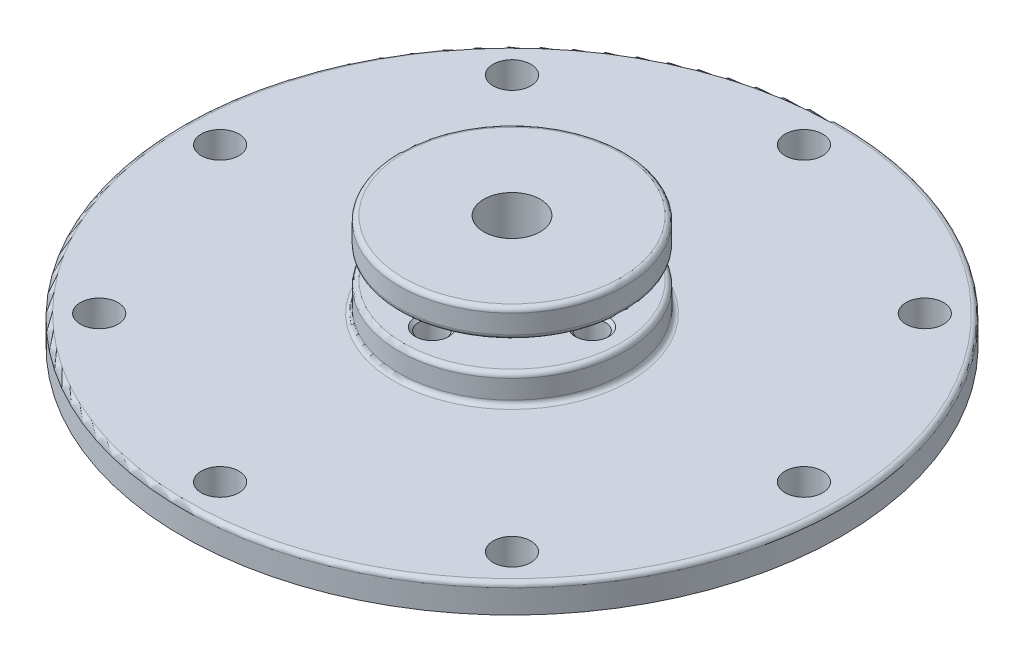
ISO-10303-21;
HEADER;
FILE_DESCRIPTION(('STEP AP214'),'2;1');
FILE_NAME('part.step','',(''),(''),'','','');
FILE_SCHEMA(('AUTOMOTIVE_DESIGN { 1 0 10303 214 1 1 1 1 }'));
ENDSEC;
DATA;
#1=APPLICATION_CONTEXT('core data for automotive mechanical design processes');
#2=APPLICATION_PROTOCOL_DEFINITION('international standard','automotive_design',2000,#1);
#3=PRODUCT_CONTEXT('',#1,'mechanical');
#4=PRODUCT('Part','Part','',(#3));
#5=PRODUCT_RELATED_PRODUCT_CATEGORY('part','',(#4));
#6=PRODUCT_DEFINITION_FORMATION('','',#4);
#7=PRODUCT_DEFINITION_CONTEXT('part definition',#1,'design');
#8=PRODUCT_DEFINITION('design','',#6,#7);
#9=PRODUCT_DEFINITION_SHAPE('','',#8);
#10=(LENGTH_UNIT() NAMED_UNIT(*) SI_UNIT(.MILLI.,.METRE.));
#11=(NAMED_UNIT(*) PLANE_ANGLE_UNIT() SI_UNIT($,.RADIAN.));
#12=(NAMED_UNIT(*) SI_UNIT($,.STERADIAN.) SOLID_ANGLE_UNIT());
#13=UNCERTAINTY_MEASURE_WITH_UNIT(LENGTH_MEASURE(1.E-05),#10,'distance_accuracy_value','');
#14=(GEOMETRIC_REPRESENTATION_CONTEXT(3) GLOBAL_UNCERTAINTY_ASSIGNED_CONTEXT((#13)) GLOBAL_UNIT_ASSIGNED_CONTEXT((#10,
#11,#12)) REPRESENTATION_CONTEXT('',''));
#15=CARTESIAN_POINT('',(0.,0.,0.));
#16=DIRECTION('',(0.,0.,1.));
#17=DIRECTION('',(1.,0.,0.));
#18=AXIS2_PLACEMENT_3D('',#15,#16,#17);
#19=CARTESIAN_POINT('',(0.,0.,0.));
#20=DIRECTION('',(0.,-1.,0.));
#21=DIRECTION('',(0.,0.,-1.));
#22=AXIS2_PLACEMENT_3D('',#19,#20,#21);
#23=CYLINDRICAL_SURFACE('',#22,3.);
#24=CARTESIAN_POINT('',(0.,16.,0.));
#25=DIRECTION('',(0.,-1.,0.));
#26=DIRECTION('',(0.,0.,-1.));
#27=AXIS2_PLACEMENT_3D('',#24,#25,#26);
#28=CIRCLE('',#27,3.);
#29=CARTESIAN_POINT('',(0.,16.,-3.));
#30=VERTEX_POINT('',#29);
#31=EDGE_CURVE('E88',#30,#30,#28,.T.);
#32=ORIENTED_EDGE('',*,*,#31,.F.);
#33=EDGE_LOOP('',(#32));
#34=FACE_BOUND('',#33,.T.);
#35=CARTESIAN_POINT('',(0.,9.,0.));
#36=DIRECTION('',(0.,-1.,0.));
#37=DIRECTION('',(0.,0.,-1.));
#38=AXIS2_PLACEMENT_3D('',#35,#36,#37);
#39=CIRCLE('',#38,3.);
#40=CARTESIAN_POINT('',(0.,9.,-3.));
#41=VERTEX_POINT('',#40);
#42=EDGE_CURVE('E12',#41,#41,#39,.T.);
#43=ORIENTED_EDGE('',*,*,#42,.T.);
#44=EDGE_LOOP('',(#43));
#45=FACE_BOUND('',#44,.T.);
#46=ADVANCED_FACE('F60',(#34,#45),#23,.F.);
#47=CARTESIAN_POINT('',(-3.,9.,0.));
#48=DIRECTION('',(0.,1.,0.));
#49=DIRECTION('',(0.,0.,1.));
#50=AXIS2_PLACEMENT_3D('',#47,#48,#49);
#51=PLANE('',#50);
#52=ORIENTED_EDGE('',*,*,#42,.F.);
#53=EDGE_LOOP('',(#52));
#54=FACE_BOUND('',#53,.T.);
#55=CARTESIAN_POINT('',(0.,9.,0.));
#56=DIRECTION('',(0.,-1.,0.));
#57=DIRECTION('',(0.,0.,-1.));
#58=AXIS2_PLACEMENT_3D('',#55,#56,#57);
#59=CIRCLE('',#58,6.);
#60=CARTESIAN_POINT('',(0.,9.,-6.));
#61=VERTEX_POINT('',#60);
#62=EDGE_CURVE('E66',#61,#61,#59,.T.);
#63=ORIENTED_EDGE('',*,*,#62,.T.);
#64=EDGE_LOOP('',(#63));
#65=FACE_BOUND('',#64,.T.);
#66=ADVANCED_FACE('F95',(#54,#65),#51,.F.);
#67=CARTESIAN_POINT('',(0.,0.,0.));
#68=DIRECTION('',(0.,-1.,0.));
#69=DIRECTION('',(0.,0.,-1.));
#70=AXIS2_PLACEMENT_3D('',#67,#68,#69);
#71=CYLINDRICAL_SURFACE('',#70,6.);
#72=ORIENTED_EDGE('',*,*,#62,.F.);
#73=EDGE_LOOP('',(#72));
#74=FACE_BOUND('',#73,.T.);
#75=CARTESIAN_POINT('',(0.,13.,0.));
#76=DIRECTION('',(0.,-1.,0.));
#77=DIRECTION('',(0.,0.,-1.));
#78=AXIS2_PLACEMENT_3D('',#75,#76,#77);
#79=CIRCLE('',#78,6.);
#80=CARTESIAN_POINT('',(0.,13.,-6.));
#81=VERTEX_POINT('',#80);
#82=EDGE_CURVE('E70',#81,#81,#79,.T.);
#83=ORIENTED_EDGE('',*,*,#82,.T.);
#84=EDGE_LOOP('',(#83));
#85=FACE_BOUND('',#84,.T.);
#86=ADVANCED_FACE('F99',(#74,#85),#71,.T.);
#87=CARTESIAN_POINT('',(-6.,13.,0.));
#88=DIRECTION('',(0.,1.,0.));
#89=DIRECTION('',(0.,0.,1.));
#90=AXIS2_PLACEMENT_3D('',#87,#88,#89);
#91=PLANE('',#90);
#92=ORIENTED_EDGE('',*,*,#82,.F.);
#93=EDGE_LOOP('',(#92));
#94=FACE_BOUND('',#93,.T.);
#95=CARTESIAN_POINT('',(0.,13.,0.));
#96=DIRECTION('',(0.,-1.,0.));
#97=DIRECTION('',(0.,0.,-1.));
#98=AXIS2_PLACEMENT_3D('',#95,#96,#97);
#99=CIRCLE('',#98,11.5);
#100=CARTESIAN_POINT('',(0.,13.,-11.5));
#101=VERTEX_POINT('',#100);
#102=EDGE_CURVE('E74',#101,#101,#99,.T.);
#103=ORIENTED_EDGE('',*,*,#102,.T.);
#104=EDGE_LOOP('',(#103));
#105=FACE_BOUND('',#104,.T.);
#106=ADVANCED_FACE('F104',(#94,#105),#91,.F.);
#107=CARTESIAN_POINT('',(0.,13.5,0.));
#108=DIRECTION('',(0.,-1.,0.));
#109=DIRECTION('',(0.,0.,-1.));
#110=AXIS2_PLACEMENT_3D('',#107,#108,#109);
#111=TOROIDAL_SURFACE('',#110,11.5,0.5);
#112=ORIENTED_EDGE('',*,*,#102,.F.);
#113=EDGE_LOOP('',(#112));
#114=FACE_BOUND('',#113,.T.);
#115=CARTESIAN_POINT('',(0.,13.5,0.));
#116=DIRECTION('',(0.,-1.,0.));
#117=DIRECTION('',(0.,0.,-1.));
#118=AXIS2_PLACEMENT_3D('',#115,#116,#117);
#119=CIRCLE('',#118,12.);
#120=CARTESIAN_POINT('',(0.,13.5,-12.));
#121=VERTEX_POINT('',#120);
#122=EDGE_CURVE('E79',#121,#121,#119,.T.);
#123=ORIENTED_EDGE('',*,*,#122,.T.);
#124=EDGE_LOOP('',(#123));
#125=FACE_BOUND('',#124,.T.);
#126=ADVANCED_FACE('F110',(#114,#125),#111,.T.);
#127=CARTESIAN_POINT('',(0.,0.,0.));
#128=DIRECTION('',(0.,-1.,0.));
#129=DIRECTION('',(0.,0.,-1.));
#130=AXIS2_PLACEMENT_3D('',#127,#128,#129);
#131=CYLINDRICAL_SURFACE('',#130,12.);
#132=ORIENTED_EDGE('',*,*,#122,.F.);
#133=EDGE_LOOP('',(#132));
#134=FACE_BOUND('',#133,.T.);
#135=CARTESIAN_POINT('',(0.,15.5,0.));
#136=DIRECTION('',(0.,-1.,0.));
#137=DIRECTION('',(0.,0.,-1.));
#138=AXIS2_PLACEMENT_3D('',#135,#136,#137);
#139=CIRCLE('',#138,12.);
#140=CARTESIAN_POINT('',(0.,15.5,-12.));
#141=VERTEX_POINT('',#140);
#142=EDGE_CURVE('E82',#141,#141,#139,.T.);
#143=ORIENTED_EDGE('',*,*,#142,.T.);
#144=EDGE_LOOP('',(#143));
#145=FACE_BOUND('',#144,.T.);
#146=ADVANCED_FACE('F114',(#134,#145),#131,.T.);
#147=CARTESIAN_POINT('',(0.,15.5,0.));
#148=DIRECTION('',(0.,-1.,0.));
#149=DIRECTION('',(0.,0.,-1.));
#150=AXIS2_PLACEMENT_3D('',#147,#148,#149);
#151=TOROIDAL_SURFACE('',#150,11.5,0.5);
#152=ORIENTED_EDGE('',*,*,#142,.F.);
#153=EDGE_LOOP('',(#152));
#154=FACE_BOUND('',#153,.T.);
#155=CARTESIAN_POINT('',(0.,16.,0.));
#156=DIRECTION('',(0.,-1.,0.));
#157=DIRECTION('',(0.,0.,-1.));
#158=AXIS2_PLACEMENT_3D('',#155,#156,#157);
#159=CIRCLE('',#158,11.5);
#160=CARTESIAN_POINT('',(0.,16.,-11.5));
#161=VERTEX_POINT('',#160);
#162=EDGE_CURVE('E85',#161,#161,#159,.T.);
#163=ORIENTED_EDGE('',*,*,#162,.T.);
#164=EDGE_LOOP('',(#163));
#165=FACE_BOUND('',#164,.T.);
#166=ADVANCED_FACE('F118',(#154,#165),#151,.T.);
#167=CARTESIAN_POINT('',(-11.5,16.,0.));
#168=DIRECTION('',(0.,-1.,0.));
#169=DIRECTION('',(0.,0.,-1.));
#170=AXIS2_PLACEMENT_3D('',#167,#168,#169);
#171=PLANE('',#170);
#172=ORIENTED_EDGE('',*,*,#162,.F.);
#173=EDGE_LOOP('',(#172));
#174=FACE_BOUND('',#173,.T.);
#175=ORIENTED_EDGE('',*,*,#31,.T.);
#176=EDGE_LOOP('',(#175));
#177=FACE_BOUND('',#176,.T.);
#178=ADVANCED_FACE('F92',(#174,#177),#171,.F.);
#179=CLOSED_SHELL('',(#46,#66,#86,#106,#126,#146,#166,#178));
#180=MANIFOLD_SOLID_BREP('B2',#179);
#181=CARTESIAN_POINT('',(-6.,6.,0.));
#182=DIRECTION('',(0.,1.,0.));
#183=DIRECTION('',(0.,0.,1.));
#184=AXIS2_PLACEMENT_3D('',#181,#182,#183);
#185=PLANE('',#184);
#186=CARTESIAN_POINT('',(0.,6.,0.));
#187=DIRECTION('',(0.,-1.,0.));
#188=DIRECTION('',(0.,0.,-1.));
#189=AXIS2_PLACEMENT_3D('',#186,#187,#188);
#190=CIRCLE('',#189,3.);
#191=CARTESIAN_POINT('',(0.,6.,-3.));
#192=VERTEX_POINT('',#191);
#193=EDGE_CURVE('E220',#192,#192,#190,.T.);
#194=ORIENTED_EDGE('',*,*,#193,.F.);
#195=EDGE_LOOP('',(#194));
#196=FACE_BOUND('',#195,.T.);
#197=CARTESIAN_POINT('',(0.,6.,0.));
#198=DIRECTION('',(0.,-1.,0.));
#199=DIRECTION('',(0.,0.,-1.));
#200=AXIS2_PLACEMENT_3D('',#197,#198,#199);
#201=CIRCLE('',#200,6.);
#202=CARTESIAN_POINT('',(0.,6.,-6.));
#203=VERTEX_POINT('',#202);
#204=EDGE_CURVE('E59',#203,#203,#201,.T.);
#205=ORIENTED_EDGE('',*,*,#204,.T.);
#206=EDGE_LOOP('',(#205));
#207=FACE_BOUND('',#206,.T.);
#208=ADVANCED_FACE('F206',(#196,#207),#185,.F.);
#209=CARTESIAN_POINT('',(0.,0.,0.));
#210=DIRECTION('',(0.,-1.,0.));
#211=DIRECTION('',(0.,0.,-1.));
#212=AXIS2_PLACEMENT_3D('',#209,#210,#211);
#213=CYLINDRICAL_SURFACE('',#212,6.);
#214=ORIENTED_EDGE('',*,*,#204,.F.);
#215=EDGE_LOOP('',(#214));
#216=FACE_BOUND('',#215,.T.);
#217=CARTESIAN_POINT('',(0.,9.,0.));
#218=DIRECTION('',(0.,-1.,0.));
#219=DIRECTION('',(0.,0.,-1.));
#220=AXIS2_PLACEMENT_3D('',#217,#218,#219);
#221=CIRCLE('',#220,6.);
#222=CARTESIAN_POINT('',(0.,9.,-6.));
#223=VERTEX_POINT('',#222);
#224=EDGE_CURVE('E212',#223,#223,#221,.T.);
#225=ORIENTED_EDGE('',*,*,#224,.T.);
#226=EDGE_LOOP('',(#225));
#227=FACE_BOUND('',#226,.T.);
#228=ADVANCED_FACE('F229',(#216,#227),#213,.T.);
#229=CARTESIAN_POINT('',(-3.,9.,0.));
#230=DIRECTION('',(0.,-1.,0.));
#231=DIRECTION('',(0.,0.,-1.));
#232=AXIS2_PLACEMENT_3D('',#229,#230,#231);
#233=PLANE('',#232);
#234=ORIENTED_EDGE('',*,*,#224,.F.);
#235=EDGE_LOOP('',(#234));
#236=FACE_BOUND('',#235,.T.);
#237=CARTESIAN_POINT('',(0.,9.,0.));
#238=DIRECTION('',(0.,-1.,0.));
#239=DIRECTION('',(0.,0.,-1.));
#240=AXIS2_PLACEMENT_3D('',#237,#238,#239);
#241=CIRCLE('',#240,3.);
#242=CARTESIAN_POINT('',(0.,9.,-3.));
#243=VERTEX_POINT('',#242);
#244=EDGE_CURVE('E216',#243,#243,#241,.T.);
#245=ORIENTED_EDGE('',*,*,#244,.T.);
#246=EDGE_LOOP('',(#245));
#247=FACE_BOUND('',#246,.T.);
#248=ADVANCED_FACE('F233',(#236,#247),#233,.F.);
#249=CARTESIAN_POINT('',(0.,0.,0.));
#250=DIRECTION('',(0.,-1.,0.));
#251=DIRECTION('',(0.,0.,-1.));
#252=AXIS2_PLACEMENT_3D('',#249,#250,#251);
#253=CYLINDRICAL_SURFACE('',#252,3.);
#254=ORIENTED_EDGE('',*,*,#244,.F.);
#255=EDGE_LOOP('',(#254));
#256=FACE_BOUND('',#255,.T.);
#257=ORIENTED_EDGE('',*,*,#193,.T.);
#258=EDGE_LOOP('',(#257));
#259=FACE_BOUND('',#258,.T.);
#260=ADVANCED_FACE('F226',(#256,#259),#253,.F.);
#261=CLOSED_SHELL('',(#208,#228,#248,#260));
#262=MANIFOLD_SOLID_BREP('B7',#261);
#263=CARTESIAN_POINT('',(0.,11.6458759661748,0.));
#264=DIRECTION('',(0.,1.,0.));
#265=DIRECTION('',(0.,0.,1.));
#266=AXIS2_PLACEMENT_3D('',#263,#264,#265);
#267=CYLINDRICAL_SURFACE('',#266,3.);
#268=CARTESIAN_POINT('',(0.,6.,0.));
#269=DIRECTION('',(0.,1.,0.));
#270=DIRECTION('',(0.,0.,1.));
#271=AXIS2_PLACEMENT_3D('',#268,#269,#270);
#272=CIRCLE('',#271,3.);
#273=CARTESIAN_POINT('',(0.,6.,3.));
#274=VERTEX_POINT('',#273);
#275=EDGE_CURVE('E307',#274,#274,#272,.T.);
#276=ORIENTED_EDGE('',*,*,#275,.T.);
#277=EDGE_LOOP('',(#276));
#278=FACE_BOUND('',#277,.T.);
#279=CARTESIAN_POINT('',(0.,0.,0.));
#280=DIRECTION('',(0.,1.,0.));
#281=DIRECTION('',(0.,0.,1.));
#282=AXIS2_PLACEMENT_3D('',#279,#280,#281);
#283=CIRCLE('',#282,3.);
#284=CARTESIAN_POINT('',(0.,0.,3.));
#285=VERTEX_POINT('',#284);
#286=EDGE_CURVE('E205',#285,#285,#283,.T.);
#287=ORIENTED_EDGE('',*,*,#286,.F.);
#288=EDGE_LOOP('',(#287));
#289=FACE_BOUND('',#288,.T.);
#290=ADVANCED_FACE('F285',(#278,#289),#267,.F.);
#291=CARTESIAN_POINT('',(-3.,0.,0.));
#292=DIRECTION('',(0.,-1.,0.));
#293=DIRECTION('',(0.,0.,-1.));
#294=AXIS2_PLACEMENT_3D('',#291,#292,#293);
#295=PLANE('',#294);
#296=ORIENTED_EDGE('',*,*,#286,.T.);
#297=EDGE_LOOP('',(#296));
#298=FACE_BOUND('',#297,.T.);
#299=CARTESIAN_POINT('',(0.,0.,0.));
#300=DIRECTION('',(0.,1.,0.));
#301=DIRECTION('',(0.,0.,1.));
#302=AXIS2_PLACEMENT_3D('',#299,#300,#301);
#303=CIRCLE('',#302,4.5);
#304=CARTESIAN_POINT('',(0.,0.,4.5));
#305=VERTEX_POINT('',#304);
#306=EDGE_CURVE('E291',#305,#305,#303,.T.);
#307=ORIENTED_EDGE('',*,*,#306,.F.);
#308=EDGE_LOOP('',(#307));
#309=FACE_BOUND('',#308,.T.);
#310=ADVANCED_FACE('F325',(#298,#309),#295,.T.);
#311=CARTESIAN_POINT('',(0.,11.6458759661748,0.));
#312=DIRECTION('',(0.,1.,0.));
#313=DIRECTION('',(0.,0.,1.));
#314=AXIS2_PLACEMENT_3D('',#311,#312,#313);
#315=CYLINDRICAL_SURFACE('',#314,4.5);
#316=ORIENTED_EDGE('',*,*,#306,.T.);
#317=EDGE_LOOP('',(#316));
#318=FACE_BOUND('',#317,.T.);
#319=CARTESIAN_POINT('',(0.,4.,0.));
#320=DIRECTION('',(0.,1.,0.));
#321=DIRECTION('',(0.,0.,1.));
#322=AXIS2_PLACEMENT_3D('',#319,#320,#321);
#323=CIRCLE('',#322,4.5);
#324=CARTESIAN_POINT('',(0.,4.,4.5));
#325=VERTEX_POINT('',#324);
#326=EDGE_CURVE('E295',#325,#325,#323,.T.);
#327=ORIENTED_EDGE('',*,*,#326,.F.);
#328=EDGE_LOOP('',(#327));
#329=FACE_BOUND('',#328,.T.);
#330=ADVANCED_FACE('F329',(#318,#329),#315,.T.);
#331=CARTESIAN_POINT('',(-4.5,4.,0.));
#332=DIRECTION('',(0.,-1.,0.));
#333=DIRECTION('',(0.,0.,-1.));
#334=AXIS2_PLACEMENT_3D('',#331,#332,#333);
#335=PLANE('',#334);
#336=ORIENTED_EDGE('',*,*,#326,.T.);
#337=EDGE_LOOP('',(#336));
#338=FACE_BOUND('',#337,.T.);
#339=CARTESIAN_POINT('',(0.,4.,0.));
#340=DIRECTION('',(0.,1.,0.));
#341=DIRECTION('',(0.,0.,1.));
#342=AXIS2_PLACEMENT_3D('',#339,#340,#341);
#343=CIRCLE('',#342,6.);
#344=CARTESIAN_POINT('',(0.,4.,6.));
#345=VERTEX_POINT('',#344);
#346=EDGE_CURVE('E299',#345,#345,#343,.T.);
#347=ORIENTED_EDGE('',*,*,#346,.F.);
#348=EDGE_LOOP('',(#347));
#349=FACE_BOUND('',#348,.T.);
#350=ADVANCED_FACE('F321',(#338,#349),#335,.T.);
#351=CARTESIAN_POINT('',(0.,11.6458759661748,0.));
#352=DIRECTION('',(0.,1.,0.));
#353=DIRECTION('',(0.,0.,1.));
#354=AXIS2_PLACEMENT_3D('',#351,#352,#353);
#355=CYLINDRICAL_SURFACE('',#354,6.);
#356=ORIENTED_EDGE('',*,*,#346,.T.);
#357=EDGE_LOOP('',(#356));
#358=FACE_BOUND('',#357,.T.);
#359=CARTESIAN_POINT('',(0.,6.,0.));
#360=DIRECTION('',(0.,1.,0.));
#361=DIRECTION('',(0.,0.,1.));
#362=AXIS2_PLACEMENT_3D('',#359,#360,#361);
#363=CIRCLE('',#362,6.);
#364=CARTESIAN_POINT('',(0.,6.,6.));
#365=VERTEX_POINT('',#364);
#366=EDGE_CURVE('E304',#365,#365,#363,.T.);
#367=ORIENTED_EDGE('',*,*,#366,.F.);
#368=EDGE_LOOP('',(#367));
#369=FACE_BOUND('',#368,.T.);
#370=ADVANCED_FACE('F315',(#358,#369),#355,.T.);
#371=CARTESIAN_POINT('',(-6.,6.,0.));
#372=DIRECTION('',(0.,1.,0.));
#373=DIRECTION('',(0.,0.,1.));
#374=AXIS2_PLACEMENT_3D('',#371,#372,#373);
#375=PLANE('',#374);
#376=ORIENTED_EDGE('',*,*,#366,.T.);
#377=EDGE_LOOP('',(#376));
#378=FACE_BOUND('',#377,.T.);
#379=ORIENTED_EDGE('',*,*,#275,.F.);
#380=EDGE_LOOP('',(#379));
#381=FACE_BOUND('',#380,.T.);
#382=ADVANCED_FACE('F313',(#378,#381),#375,.T.);
#383=CLOSED_SHELL('',(#290,#310,#330,#350,#370,#382));
#384=MANIFOLD_SOLID_BREP('B54',#383);
#385=CARTESIAN_POINT('',(0.,6.5,0.));
#386=DIRECTION('',(0.,1.,0.));
#387=DIRECTION('',(-1.,0.,0.));
#388=AXIS2_PLACEMENT_3D('',#385,#386,#387);
#389=TOROIDAL_SURFACE('',#388,34.5,0.5);
#390=CARTESIAN_POINT('',(0.,6.5,0.));
#391=DIRECTION('',(0.,1.,0.));
#392=DIRECTION('',(-1.,0.,0.));
#393=AXIS2_PLACEMENT_3D('',#390,#391,#392);
#394=CIRCLE('',#393,35.);
#395=CARTESIAN_POINT('',(-35.,6.49999999999999,0.));
#396=VERTEX_POINT('',#395);
#397=EDGE_CURVE('E283',#396,#396,#394,.T.);
#398=ORIENTED_EDGE('',*,*,#397,.T.);
#399=EDGE_LOOP('',(#398));
#400=FACE_BOUND('',#399,.T.);
#401=CARTESIAN_POINT('',(0.,7.,0.));
#402=DIRECTION('',(0.,1.,0.));
#403=DIRECTION('',(-1.,0.,0.));
#404=AXIS2_PLACEMENT_3D('',#401,#402,#403);
#405=CIRCLE('',#404,34.5);
#406=CARTESIAN_POINT('',(-34.5,7.,0.));
#407=VERTEX_POINT('',#406);
#408=EDGE_CURVE('E506',#407,#407,#405,.T.);
#409=ORIENTED_EDGE('',*,*,#408,.F.);
#410=EDGE_LOOP('',(#409));
#411=FACE_BOUND('',#410,.T.);
#412=ADVANCED_FACE('F389',(#400,#411),#389,.T.);
#413=CARTESIAN_POINT('',(0.,16.3066887848582,0.));
#414=DIRECTION('',(0.,1.,0.));
#415=DIRECTION('',(-1.,0.,0.));
#416=AXIS2_PLACEMENT_3D('',#413,#414,#415);
#417=CYLINDRICAL_SURFACE('',#416,35.);
#418=CARTESIAN_POINT('',(0.,4.,0.));
#419=DIRECTION('',(0.,1.,0.));
#420=DIRECTION('',(-1.,0.,0.));
#421=AXIS2_PLACEMENT_3D('',#418,#419,#420);
#422=CIRCLE('',#421,35.);
#423=CARTESIAN_POINT('',(-35.,4.,0.));
#424=VERTEX_POINT('',#423);
#425=EDGE_CURVE('E398',#424,#424,#422,.T.);
#426=ORIENTED_EDGE('',*,*,#425,.T.);
#427=EDGE_LOOP('',(#426));
#428=FACE_BOUND('',#427,.T.);
#429=ORIENTED_EDGE('',*,*,#397,.F.);
#430=EDGE_LOOP('',(#429));
#431=FACE_BOUND('',#430,.T.);
#432=ADVANCED_FACE('F656',(#428,#431),#417,.T.);
#433=CARTESIAN_POINT('',(-35.,4.,0.));
#434=DIRECTION('',(0.,-1.,0.));
#435=DIRECTION('',(1.,0.,0.));
#436=AXIS2_PLACEMENT_3D('',#433,#434,#435);
#437=PLANE('',#436);
#438=CARTESIAN_POINT('',(0.,4.,-31.));
#439=DIRECTION('',(0.,-1.,0.));
#440=DIRECTION('',(1.,0.,0.));
#441=AXIS2_PLACEMENT_3D('',#438,#439,#440);
#442=CIRCLE('',#441,2.);
#443=CARTESIAN_POINT('',(2.,4.,-31.));
#444=VERTEX_POINT('',#443);
#445=EDGE_CURVE('E502',#444,#444,#442,.T.);
#446=ORIENTED_EDGE('',*,*,#445,.F.);
#447=EDGE_LOOP('',(#446));
#448=FACE_BOUND('',#447,.T.);
#449=CARTESIAN_POINT('',(21.920310216783,4.00000000000001,-21.9203102167829));
#450=DIRECTION('',(0.,-1.,0.));
#451=DIRECTION('',(1.,0.,0.));
#452=AXIS2_PLACEMENT_3D('',#449,#450,#451);
#453=CIRCLE('',#452,2.);
#454=CARTESIAN_POINT('',(23.920310216783,4.00000000000001,-21.9203102167829));
#455=VERTEX_POINT('',#454);
#456=EDGE_CURVE('E498',#455,#455,#453,.T.);
#457=ORIENTED_EDGE('',*,*,#456,.F.);
#458=EDGE_LOOP('',(#457));
#459=FACE_BOUND('',#458,.T.);
#460=CARTESIAN_POINT('',(31.,4.00000000000001,1.08235921504137E-13));
#461=DIRECTION('',(0.,-1.,0.));
#462=DIRECTION('',(1.,0.,0.));
#463=AXIS2_PLACEMENT_3D('',#460,#461,#462);
#464=CIRCLE('',#463,2.);
#465=CARTESIAN_POINT('',(33.,4.00000000000001,1.08235921504137E-13));
#466=VERTEX_POINT('',#465);
#467=EDGE_CURVE('E493',#466,#466,#464,.T.);
#468=ORIENTED_EDGE('',*,*,#467,.F.);
#469=EDGE_LOOP('',(#468));
#470=FACE_BOUND('',#469,.T.);
#471=CARTESIAN_POINT('',(21.9203102167829,4.00000000000001,21.9203102167831));
#472=DIRECTION('',(0.,-1.,0.));
#473=DIRECTION('',(1.,0.,0.));
#474=AXIS2_PLACEMENT_3D('',#471,#472,#473);
#475=CIRCLE('',#474,2.);
#476=CARTESIAN_POINT('',(23.9203102167828,4.00000000000001,21.9203102167831));
#477=VERTEX_POINT('',#476);
#478=EDGE_CURVE('E488',#477,#477,#475,.T.);
#479=ORIENTED_EDGE('',*,*,#478,.F.);
#480=EDGE_LOOP('',(#479));
#481=FACE_BOUND('',#480,.T.);
#482=CARTESIAN_POINT('',(-2.16959711872735E-13,4.,31.));
#483=DIRECTION('',(0.,-1.,0.));
#484=DIRECTION('',(1.,0.,0.));
#485=AXIS2_PLACEMENT_3D('',#482,#483,#484);
#486=CIRCLE('',#485,2.);
#487=CARTESIAN_POINT('',(1.99999999999978,4.,31.));
#488=VERTEX_POINT('',#487);
#489=EDGE_CURVE('E483',#488,#488,#486,.T.);
#490=ORIENTED_EDGE('',*,*,#489,.F.);
#491=EDGE_LOOP('',(#490));
#492=FACE_BOUND('',#491,.T.);
#493=CARTESIAN_POINT('',(-21.9203102167832,4.,21.9203102167828));
#494=DIRECTION('',(0.,-1.,0.));
#495=DIRECTION('',(1.,0.,0.));
#496=AXIS2_PLACEMENT_3D('',#493,#494,#495);
#497=CIRCLE('',#496,2.);
#498=CARTESIAN_POINT('',(-19.9203102167832,4.,21.9203102167828));
#499=VERTEX_POINT('',#498);
#500=EDGE_CURVE('E478',#499,#499,#497,.T.);
#501=ORIENTED_EDGE('',*,*,#500,.F.);
#502=EDGE_LOOP('',(#501));
#503=FACE_BOUND('',#502,.T.);
#504=CARTESIAN_POINT('',(-31.,4.,-3.24707764512411E-13));
#505=DIRECTION('',(0.,-1.,0.));
#506=DIRECTION('',(1.,0.,0.));
#507=AXIS2_PLACEMENT_3D('',#504,#505,#506);
#508=CIRCLE('',#507,2.);
#509=CARTESIAN_POINT('',(-29.,4.,-3.24707764512411E-13));
#510=VERTEX_POINT('',#509);
#511=EDGE_CURVE('E473',#510,#510,#508,.T.);
#512=ORIENTED_EDGE('',*,*,#511,.F.);
#513=EDGE_LOOP('',(#512));
#514=FACE_BOUND('',#513,.T.);
#515=CARTESIAN_POINT('',(-21.9203102167827,4.,-21.9203102167832));
#516=DIRECTION('',(0.,-1.,0.));
#517=DIRECTION('',(1.,0.,0.));
#518=AXIS2_PLACEMENT_3D('',#515,#516,#517);
#519=CIRCLE('',#518,2.);
#520=CARTESIAN_POINT('',(-19.9203102167827,4.,-21.9203102167832));
#521=VERTEX_POINT('',#520);
#522=EDGE_CURVE('E468',#521,#521,#519,.T.);
#523=ORIENTED_EDGE('',*,*,#522,.F.);
#524=EDGE_LOOP('',(#523));
#525=FACE_BOUND('',#524,.T.);
#526=CARTESIAN_POINT('',(0.,4.,0.));
#527=DIRECTION('',(0.,1.,0.));
#528=DIRECTION('',(-1.,0.,0.));
#529=AXIS2_PLACEMENT_3D('',#526,#527,#528);
#530=CIRCLE('',#529,22.5);
#531=CARTESIAN_POINT('',(-22.5,4.,0.));
#532=VERTEX_POINT('',#531);
#533=EDGE_CURVE('E546',#532,#532,#530,.T.);
#534=ORIENTED_EDGE('',*,*,#533,.T.);
#535=EDGE_LOOP('',(#534));
#536=FACE_BOUND('',#535,.T.);
#537=ORIENTED_EDGE('',*,*,#425,.F.);
#538=EDGE_LOOP('',(#537));
#539=FACE_BOUND('',#538,.T.);
#540=ADVANCED_FACE('F650',(#448,#459,#470,#481,#492,#503,#514,#525,#536,#539),#437,.T.);
#541=CARTESIAN_POINT('',(0.,16.3066887848582,0.));
#542=DIRECTION('',(0.,1.,0.));
#543=DIRECTION('',(-1.,0.,0.));
#544=AXIS2_PLACEMENT_3D('',#541,#542,#543);
#545=CYLINDRICAL_SURFACE('',#544,22.5);
#546=CARTESIAN_POINT('',(0.,0.,0.));
#547=DIRECTION('',(0.,1.,0.));
#548=DIRECTION('',(-1.,0.,0.));
#549=AXIS2_PLACEMENT_3D('',#546,#547,#548);
#550=CIRCLE('',#549,22.5);
#551=CARTESIAN_POINT('',(-22.5,0.,0.));
#552=VERTEX_POINT('',#551);
#553=EDGE_CURVE('E542',#552,#552,#550,.T.);
#554=ORIENTED_EDGE('',*,*,#553,.T.);
#555=EDGE_LOOP('',(#554));
#556=FACE_BOUND('',#555,.T.);
#557=ORIENTED_EDGE('',*,*,#533,.F.);
#558=EDGE_LOOP('',(#557));
#559=FACE_BOUND('',#558,.T.);
#560=ADVANCED_FACE('F644',(#556,#559),#545,.T.);
#561=CARTESIAN_POINT('',(-22.5,0.,0.));
#562=DIRECTION('',(0.,-1.,0.));
#563=DIRECTION('',(1.,0.,0.));
#564=AXIS2_PLACEMENT_3D('',#561,#562,#563);
#565=PLANE('',#564);
#566=CARTESIAN_POINT('',(0.,0.,0.));
#567=DIRECTION('',(0.,1.,0.));
#568=DIRECTION('',(-1.,0.,0.));
#569=AXIS2_PLACEMENT_3D('',#566,#567,#568);
#570=CIRCLE('',#569,4.5);
#571=CARTESIAN_POINT('',(-4.5,0.,0.));
#572=VERTEX_POINT('',#571);
#573=EDGE_CURVE('E538',#572,#572,#570,.T.);
#574=ORIENTED_EDGE('',*,*,#573,.T.);
#575=EDGE_LOOP('',(#574));
#576=FACE_BOUND('',#575,.T.);
#577=ORIENTED_EDGE('',*,*,#553,.F.);
#578=EDGE_LOOP('',(#577));
#579=FACE_BOUND('',#578,.T.);
#580=ADVANCED_FACE('F638',(#576,#579),#565,.T.);
#581=CARTESIAN_POINT('',(0.,16.3066887848582,0.));
#582=DIRECTION('',(0.,1.,0.));
#583=DIRECTION('',(-1.,0.,0.));
#584=AXIS2_PLACEMENT_3D('',#581,#582,#583);
#585=CYLINDRICAL_SURFACE('',#584,4.5);
#586=CARTESIAN_POINT('',(0.,4.,0.));
#587=DIRECTION('',(0.,1.,0.));
#588=DIRECTION('',(-1.,0.,0.));
#589=AXIS2_PLACEMENT_3D('',#586,#587,#588);
#590=CIRCLE('',#589,4.5);
#591=CARTESIAN_POINT('',(-4.5,4.,0.));
#592=VERTEX_POINT('',#591);
#593=EDGE_CURVE('E534',#592,#592,#590,.T.);
#594=ORIENTED_EDGE('',*,*,#593,.T.);
#595=EDGE_LOOP('',(#594));
#596=FACE_BOUND('',#595,.T.);
#597=ORIENTED_EDGE('',*,*,#573,.F.);
#598=EDGE_LOOP('',(#597));
#599=FACE_BOUND('',#598,.T.);
#600=ADVANCED_FACE('F632',(#596,#599),#585,.F.);
#601=CARTESIAN_POINT('',(-4.5,4.,0.));
#602=DIRECTION('',(0.,1.,0.));
#603=DIRECTION('',(-1.,0.,0.));
#604=AXIS2_PLACEMENT_3D('',#601,#602,#603);
#605=PLANE('',#604);
#606=CARTESIAN_POINT('',(0.,4.,0.));
#607=DIRECTION('',(0.,1.,0.));
#608=DIRECTION('',(-1.,0.,0.));
#609=AXIS2_PLACEMENT_3D('',#606,#607,#608);
#610=CIRCLE('',#609,6.);
#611=CARTESIAN_POINT('',(-6.,4.,0.));
#612=VERTEX_POINT('',#611);
#613=EDGE_CURVE('E530',#612,#612,#610,.T.);
#614=ORIENTED_EDGE('',*,*,#613,.T.);
#615=EDGE_LOOP('',(#614));
#616=FACE_BOUND('',#615,.T.);
#617=ORIENTED_EDGE('',*,*,#593,.F.);
#618=EDGE_LOOP('',(#617));
#619=FACE_BOUND('',#618,.T.);
#620=ADVANCED_FACE('F626',(#616,#619),#605,.T.);
#621=CARTESIAN_POINT('',(0.,16.3066887848582,0.));
#622=DIRECTION('',(0.,1.,0.));
#623=DIRECTION('',(-1.,0.,0.));
#624=AXIS2_PLACEMENT_3D('',#621,#622,#623);
#625=CYLINDRICAL_SURFACE('',#624,6.);
#626=CARTESIAN_POINT('',(0.,10.,0.));
#627=DIRECTION('',(0.,1.,0.));
#628=DIRECTION('',(-1.,0.,0.));
#629=AXIS2_PLACEMENT_3D('',#626,#627,#628);
#630=CIRCLE('',#629,6.);
#631=CARTESIAN_POINT('',(-6.,10.,0.));
#632=VERTEX_POINT('',#631);
#633=EDGE_CURVE('E526',#632,#632,#630,.T.);
#634=ORIENTED_EDGE('',*,*,#633,.T.);
#635=EDGE_LOOP('',(#634));
#636=FACE_BOUND('',#635,.T.);
#637=ORIENTED_EDGE('',*,*,#613,.F.);
#638=EDGE_LOOP('',(#637));
#639=FACE_BOUND('',#638,.T.);
#640=ADVANCED_FACE('F619',(#636,#639),#625,.F.);
#641=CARTESIAN_POINT('',(-6.,10.,0.));
#642=DIRECTION('',(0.,1.,0.));
#643=DIRECTION('',(-1.,0.,0.));
#644=AXIS2_PLACEMENT_3D('',#641,#642,#643);
#645=PLANE('',#644);
#646=CARTESIAN_POINT('',(0.,10.,-8.5));
#647=DIRECTION('',(0.,1.,0.));
#648=DIRECTION('',(0.,0.,1.));
#649=AXIS2_PLACEMENT_3D('',#646,#647,#648);
#650=CIRCLE('',#649,1.775);
#651=CARTESIAN_POINT('',(0.,10.,-6.725));
#652=VERTEX_POINT('',#651);
#653=EDGE_CURVE('E432',#652,#652,#650,.T.);
#654=ORIENTED_EDGE('',*,*,#653,.F.);
#655=EDGE_LOOP('',(#654));
#656=FACE_BOUND('',#655,.T.);
#657=CARTESIAN_POINT('',(-8.5,10.,0.));
#658=DIRECTION('',(0.,1.,0.));
#659=DIRECTION('',(0.,0.,1.));
#660=AXIS2_PLACEMENT_3D('',#657,#658,#659);
#661=CIRCLE('',#660,1.775);
#662=CARTESIAN_POINT('',(-8.5,10.,1.775));
#663=VERTEX_POINT('',#662);
#664=EDGE_CURVE('E423',#663,#663,#661,.T.);
#665=ORIENTED_EDGE('',*,*,#664,.F.);
#666=EDGE_LOOP('',(#665));
#667=FACE_BOUND('',#666,.T.);
#668=CARTESIAN_POINT('',(8.5,10.,0.));
#669=DIRECTION('',(0.,1.,0.));
#670=DIRECTION('',(0.,0.,1.));
#671=AXIS2_PLACEMENT_3D('',#668,#669,#670);
#672=CIRCLE('',#671,1.775);
#673=CARTESIAN_POINT('',(8.5,10.,1.775));
#674=VERTEX_POINT('',#673);
#675=EDGE_CURVE('E443',#674,#674,#672,.T.);
#676=ORIENTED_EDGE('',*,*,#675,.F.);
#677=EDGE_LOOP('',(#676));
#678=FACE_BOUND('',#677,.T.);
#679=CARTESIAN_POINT('',(0.,10.,8.5));
#680=DIRECTION('',(0.,1.,0.));
#681=DIRECTION('',(0.,0.,1.));
#682=AXIS2_PLACEMENT_3D('',#679,#680,#681);
#683=CIRCLE('',#682,1.775);
#684=CARTESIAN_POINT('',(0.,10.,10.275));
#685=VERTEX_POINT('',#684);
#686=EDGE_CURVE('E455',#685,#685,#683,.T.);
#687=ORIENTED_EDGE('',*,*,#686,.F.);
#688=EDGE_LOOP('',(#687));
#689=FACE_BOUND('',#688,.T.);
#690=CARTESIAN_POINT('',(0.,10.,0.));
#691=DIRECTION('',(0.,1.,0.));
#692=DIRECTION('',(-1.,0.,0.));
#693=AXIS2_PLACEMENT_3D('',#690,#691,#692);
#694=CIRCLE('',#693,11.5);
#695=CARTESIAN_POINT('',(-11.5,10.,0.));
#696=VERTEX_POINT('',#695);
#697=EDGE_CURVE('E522',#696,#696,#694,.T.);
#698=ORIENTED_EDGE('',*,*,#697,.T.);
#699=EDGE_LOOP('',(#698));
#700=FACE_BOUND('',#699,.T.);
#701=ORIENTED_EDGE('',*,*,#633,.F.);
#702=EDGE_LOOP('',(#701));
#703=FACE_BOUND('',#702,.T.);
#704=ADVANCED_FACE('F613',(#656,#667,#678,#689,#700,#703),#645,.T.);
#705=CARTESIAN_POINT('',(0.,9.5,0.));
#706=DIRECTION('',(0.,1.,0.));
#707=DIRECTION('',(-1.,0.,0.));
#708=AXIS2_PLACEMENT_3D('',#705,#706,#707);
#709=TOROIDAL_SURFACE('',#708,11.5,0.5);
#710=CARTESIAN_POINT('',(0.,9.5,0.));
#711=DIRECTION('',(0.,1.,0.));
#712=DIRECTION('',(-1.,0.,0.));
#713=AXIS2_PLACEMENT_3D('',#710,#711,#712);
#714=CIRCLE('',#713,12.);
#715=CARTESIAN_POINT('',(-12.,9.5,0.));
#716=VERTEX_POINT('',#715);
#717=EDGE_CURVE('E518',#716,#716,#714,.T.);
#718=ORIENTED_EDGE('',*,*,#717,.T.);
#719=EDGE_LOOP('',(#718));
#720=FACE_BOUND('',#719,.T.);
#721=ORIENTED_EDGE('',*,*,#697,.F.);
#722=EDGE_LOOP('',(#721));
#723=FACE_BOUND('',#722,.T.);
#724=ADVANCED_FACE('F607',(#720,#723),#709,.T.);
#725=CARTESIAN_POINT('',(0.,16.3066887848582,0.));
#726=DIRECTION('',(0.,1.,0.));
#727=DIRECTION('',(-1.,0.,0.));
#728=AXIS2_PLACEMENT_3D('',#725,#726,#727);
#729=CYLINDRICAL_SURFACE('',#728,12.);
#730=CARTESIAN_POINT('',(0.,7.50000000000001,0.));
#731=DIRECTION('',(0.,1.,0.));
#732=DIRECTION('',(-1.,0.,0.));
#733=AXIS2_PLACEMENT_3D('',#730,#731,#732);
#734=CIRCLE('',#733,12.);
#735=CARTESIAN_POINT('',(-12.,7.5,0.));
#736=VERTEX_POINT('',#735);
#737=EDGE_CURVE('E514',#736,#736,#734,.T.);
#738=ORIENTED_EDGE('',*,*,#737,.T.);
#739=EDGE_LOOP('',(#738));
#740=FACE_BOUND('',#739,.T.);
#741=ORIENTED_EDGE('',*,*,#717,.F.);
#742=EDGE_LOOP('',(#741));
#743=FACE_BOUND('',#742,.T.);
#744=ADVANCED_FACE('F601',(#740,#743),#729,.T.);
#745=CARTESIAN_POINT('',(0.,7.5,0.));
#746=DIRECTION('',(0.,1.,0.));
#747=DIRECTION('',(-1.,0.,0.));
#748=AXIS2_PLACEMENT_3D('',#745,#746,#747);
#749=TOROIDAL_SURFACE('',#748,12.5,0.5);
#750=CARTESIAN_POINT('',(0.,7.,0.));
#751=DIRECTION('',(0.,1.,0.));
#752=DIRECTION('',(-1.,0.,0.));
#753=AXIS2_PLACEMENT_3D('',#750,#751,#752);
#754=CIRCLE('',#753,12.5);
#755=CARTESIAN_POINT('',(-12.5,7.,0.));
#756=VERTEX_POINT('',#755);
#757=EDGE_CURVE('E510',#756,#756,#754,.T.);
#758=ORIENTED_EDGE('',*,*,#757,.T.);
#759=EDGE_LOOP('',(#758));
#760=FACE_BOUND('',#759,.T.);
#761=ORIENTED_EDGE('',*,*,#737,.F.);
#762=EDGE_LOOP('',(#761));
#763=FACE_BOUND('',#762,.T.);
#764=ADVANCED_FACE('F580',(#760,#763),#749,.F.);
#765=CARTESIAN_POINT('',(-12.5,7.,0.));
#766=DIRECTION('',(0.,1.,0.));
#767=DIRECTION('',(-1.,0.,0.));
#768=AXIS2_PLACEMENT_3D('',#765,#766,#767);
#769=PLANE('',#768);
#770=CARTESIAN_POINT('',(0.,7.,-31.));
#771=DIRECTION('',(0.,1.,0.));
#772=DIRECTION('',(-1.,0.,0.));
#773=AXIS2_PLACEMENT_3D('',#770,#771,#772);
#774=CIRCLE('',#773,2.);
#775=CARTESIAN_POINT('',(-2.,7.,-31.));
#776=VERTEX_POINT('',#775);
#777=EDGE_CURVE('E392',#776,#776,#774,.T.);
#778=ORIENTED_EDGE('',*,*,#777,.F.);
#779=EDGE_LOOP('',(#778));
#780=FACE_BOUND('',#779,.T.);
#781=CARTESIAN_POINT('',(21.920310216783,7.00000000000001,-21.9203102167829));
#782=DIRECTION('',(0.,1.,0.));
#783=DIRECTION('',(-1.,0.,0.));
#784=AXIS2_PLACEMENT_3D('',#781,#782,#783);
#785=CIRCLE('',#784,2.);
#786=CARTESIAN_POINT('',(19.920310216783,7.00000000000001,-21.9203102167829));
#787=VERTEX_POINT('',#786);
#788=EDGE_CURVE('E497',#787,#787,#785,.T.);
#789=ORIENTED_EDGE('',*,*,#788,.F.);
#790=EDGE_LOOP('',(#789));
#791=FACE_BOUND('',#790,.T.);
#792=CARTESIAN_POINT('',(31.,7.00000000000001,1.08235921504137E-13));
#793=DIRECTION('',(0.,1.,0.));
#794=DIRECTION('',(-1.,0.,0.));
#795=AXIS2_PLACEMENT_3D('',#792,#793,#794);
#796=CIRCLE('',#795,2.);
#797=CARTESIAN_POINT('',(29.,7.00000000000001,1.08235921504137E-13));
#798=VERTEX_POINT('',#797);
#799=EDGE_CURVE('E492',#798,#798,#796,.T.);
#800=ORIENTED_EDGE('',*,*,#799,.F.);
#801=EDGE_LOOP('',(#800));
#802=FACE_BOUND('',#801,.T.);
#803=CARTESIAN_POINT('',(21.9203102167829,7.00000000000001,21.9203102167831));
#804=DIRECTION('',(0.,1.,0.));
#805=DIRECTION('',(-1.,0.,0.));
#806=AXIS2_PLACEMENT_3D('',#803,#804,#805);
#807=CIRCLE('',#806,2.);
#808=CARTESIAN_POINT('',(19.9203102167829,7.00000000000001,21.9203102167831));
#809=VERTEX_POINT('',#808);
#810=EDGE_CURVE('E487',#809,#809,#807,.T.);
#811=ORIENTED_EDGE('',*,*,#810,.F.);
#812=EDGE_LOOP('',(#811));
#813=FACE_BOUND('',#812,.T.);
#814=CARTESIAN_POINT('',(-2.17325613521081E-13,7.,31.));
#815=DIRECTION('',(0.,1.,0.));
#816=DIRECTION('',(-1.,0.,0.));
#817=AXIS2_PLACEMENT_3D('',#814,#815,#816);
#818=CIRCLE('',#817,2.);
#819=CARTESIAN_POINT('',(-2.00000000000022,7.,31.));
#820=VERTEX_POINT('',#819);
#821=EDGE_CURVE('E482',#820,#820,#818,.T.);
#822=ORIENTED_EDGE('',*,*,#821,.F.);
#823=EDGE_LOOP('',(#822));
#824=FACE_BOUND('',#823,.T.);
#825=CARTESIAN_POINT('',(-21.9203102167832,7.,21.9203102167828));
#826=DIRECTION('',(0.,1.,0.));
#827=DIRECTION('',(-1.,0.,0.));
#828=AXIS2_PLACEMENT_3D('',#825,#826,#827);
#829=CIRCLE('',#828,2.);
#830=CARTESIAN_POINT('',(-23.9203102167832,7.,21.9203102167828));
#831=VERTEX_POINT('',#830);
#832=EDGE_CURVE('E477',#831,#831,#829,.T.);
#833=ORIENTED_EDGE('',*,*,#832,.F.);
#834=EDGE_LOOP('',(#833));
#835=FACE_BOUND('',#834,.T.);
#836=CARTESIAN_POINT('',(-31.,7.,-3.24707764512411E-13));
#837=DIRECTION('',(0.,1.,0.));
#838=DIRECTION('',(-1.,0.,0.));
#839=AXIS2_PLACEMENT_3D('',#836,#837,#838);
#840=CIRCLE('',#839,2.);
#841=CARTESIAN_POINT('',(-33.,7.,-3.24707764512411E-13));
#842=VERTEX_POINT('',#841);
#843=EDGE_CURVE('E472',#842,#842,#840,.T.);
#844=ORIENTED_EDGE('',*,*,#843,.F.);
#845=EDGE_LOOP('',(#844));
#846=FACE_BOUND('',#845,.T.);
#847=CARTESIAN_POINT('',(-21.9203102167827,7.,-21.9203102167832));
#848=DIRECTION('',(0.,1.,0.));
#849=DIRECTION('',(-1.,0.,0.));
#850=AXIS2_PLACEMENT_3D('',#847,#848,#849);
#851=CIRCLE('',#850,2.);
#852=CARTESIAN_POINT('',(-23.9203102167827,7.,-21.9203102167832));
#853=VERTEX_POINT('',#852);
#854=EDGE_CURVE('E467',#853,#853,#851,.T.);
#855=ORIENTED_EDGE('',*,*,#854,.F.);
#856=EDGE_LOOP('',(#855));
#857=FACE_BOUND('',#856,.T.);
#858=ORIENTED_EDGE('',*,*,#408,.T.);
#859=EDGE_LOOP('',(#858));
#860=FACE_BOUND('',#859,.T.);
#861=ORIENTED_EDGE('',*,*,#757,.F.);
#862=EDGE_LOOP('',(#861));
#863=FACE_BOUND('',#862,.T.);
#864=ADVANCED_FACE('F576',(#780,#791,#802,#813,#824,#835,#846,#857,#860,#863),#769,.T.);
#865=CARTESIAN_POINT('',(-21.9203102167827,0.,-21.9203102167832));
#866=DIRECTION('',(0.,1.,0.));
#867=DIRECTION('',(-1.,0.,0.));
#868=AXIS2_PLACEMENT_3D('',#865,#866,#867);
#869=CYLINDRICAL_SURFACE('',#868,2.);
#870=ORIENTED_EDGE('',*,*,#522,.T.);
#871=EDGE_LOOP('',(#870));
#872=FACE_BOUND('',#871,.T.);
#873=ORIENTED_EDGE('',*,*,#854,.T.);
#874=EDGE_LOOP('',(#873));
#875=FACE_BOUND('',#874,.T.);
#876=ADVANCED_FACE('F579',(#872,#875),#869,.F.);
#877=CARTESIAN_POINT('',(-31.,0.,-3.24707764512411E-13));
#878=DIRECTION('',(0.,1.,0.));
#879=DIRECTION('',(-1.,0.,0.));
#880=AXIS2_PLACEMENT_3D('',#877,#878,#879);
#881=CYLINDRICAL_SURFACE('',#880,2.);
#882=ORIENTED_EDGE('',*,*,#511,.T.);
#883=EDGE_LOOP('',(#882));
#884=FACE_BOUND('',#883,.T.);
#885=ORIENTED_EDGE('',*,*,#843,.T.);
#886=EDGE_LOOP('',(#885));
#887=FACE_BOUND('',#886,.T.);
#888=ADVANCED_FACE('F725',(#884,#887),#881,.F.);
#889=CARTESIAN_POINT('',(-21.9203102167832,0.,21.9203102167828));
#890=DIRECTION('',(0.,1.,0.));
#891=DIRECTION('',(-1.,0.,0.));
#892=AXIS2_PLACEMENT_3D('',#889,#890,#891);
#893=CYLINDRICAL_SURFACE('',#892,2.);
#894=ORIENTED_EDGE('',*,*,#500,.T.);
#895=EDGE_LOOP('',(#894));
#896=FACE_BOUND('',#895,.T.);
#897=ORIENTED_EDGE('',*,*,#832,.T.);
#898=EDGE_LOOP('',(#897));
#899=FACE_BOUND('',#898,.T.);
#900=ADVANCED_FACE('F733',(#896,#899),#893,.F.);
#901=CARTESIAN_POINT('',(-2.16471843008274E-13,0.,31.));
#902=DIRECTION('',(0.,1.,0.));
#903=DIRECTION('',(-1.,0.,0.));
#904=AXIS2_PLACEMENT_3D('',#901,#902,#903);
#905=CYLINDRICAL_SURFACE('',#904,2.);
#906=ORIENTED_EDGE('',*,*,#489,.T.);
#907=EDGE_LOOP('',(#906));
#908=FACE_BOUND('',#907,.T.);
#909=ORIENTED_EDGE('',*,*,#821,.T.);
#910=EDGE_LOOP('',(#909));
#911=FACE_BOUND('',#910,.T.);
#912=ADVANCED_FACE('F741',(#908,#911),#905,.F.);
#913=CARTESIAN_POINT('',(21.9203102167829,0.,21.9203102167831));
#914=DIRECTION('',(0.,1.,0.));
#915=DIRECTION('',(-1.,0.,0.));
#916=AXIS2_PLACEMENT_3D('',#913,#914,#915);
#917=CYLINDRICAL_SURFACE('',#916,2.);
#918=ORIENTED_EDGE('',*,*,#478,.T.);
#919=EDGE_LOOP('',(#918));
#920=FACE_BOUND('',#919,.T.);
#921=ORIENTED_EDGE('',*,*,#810,.T.);
#922=EDGE_LOOP('',(#921));
#923=FACE_BOUND('',#922,.T.);
#924=ADVANCED_FACE('F749',(#920,#923),#917,.F.);
#925=CARTESIAN_POINT('',(31.,0.,1.08235921504137E-13));
#926=DIRECTION('',(0.,1.,0.));
#927=DIRECTION('',(-1.,0.,0.));
#928=AXIS2_PLACEMENT_3D('',#925,#926,#927);
#929=CYLINDRICAL_SURFACE('',#928,2.);
#930=ORIENTED_EDGE('',*,*,#467,.T.);
#931=EDGE_LOOP('',(#930));
#932=FACE_BOUND('',#931,.T.);
#933=ORIENTED_EDGE('',*,*,#799,.T.);
#934=EDGE_LOOP('',(#933));
#935=FACE_BOUND('',#934,.T.);
#936=ADVANCED_FACE('F757',(#932,#935),#929,.F.);
#937=CARTESIAN_POINT('',(21.920310216783,0.,-21.9203102167829));
#938=DIRECTION('',(0.,1.,0.));
#939=DIRECTION('',(-1.,0.,0.));
#940=AXIS2_PLACEMENT_3D('',#937,#938,#939);
#941=CYLINDRICAL_SURFACE('',#940,2.);
#942=ORIENTED_EDGE('',*,*,#456,.T.);
#943=EDGE_LOOP('',(#942));
#944=FACE_BOUND('',#943,.T.);
#945=ORIENTED_EDGE('',*,*,#788,.T.);
#946=EDGE_LOOP('',(#945));
#947=FACE_BOUND('',#946,.T.);
#948=ADVANCED_FACE('F574',(#944,#947),#941,.F.);
#949=CARTESIAN_POINT('',(0.,0.,-31.));
#950=DIRECTION('',(0.,1.,0.));
#951=DIRECTION('',(-1.,0.,0.));
#952=AXIS2_PLACEMENT_3D('',#949,#950,#951);
#953=CYLINDRICAL_SURFACE('',#952,2.);
#954=ORIENTED_EDGE('',*,*,#445,.T.);
#955=EDGE_LOOP('',(#954));
#956=FACE_BOUND('',#955,.T.);
#957=ORIENTED_EDGE('',*,*,#777,.T.);
#958=EDGE_LOOP('',(#957));
#959=FACE_BOUND('',#958,.T.);
#960=ADVANCED_FACE('F772',(#956,#959),#953,.F.);
#961=CARTESIAN_POINT('',(0.,2.87124789758996,8.5));
#962=DIRECTION('',(0.,1.,0.));
#963=DIRECTION('',(0.,0.,1.));
#964=AXIS2_PLACEMENT_3D('',#961,#962,#963);
#965=CONICAL_SURFACE('',#964,1.45,1.02974425867665);
#966=CARTESIAN_POINT('',(0.,2.,8.5));
#967=VERTEX_POINT('',#966);
#968=VERTEX_LOOP('',#967);
#969=FACE_BOUND('',#968,.T.);
#970=CARTESIAN_POINT('',(0.,2.87124789758996,8.5));
#971=DIRECTION('',(0.,1.,0.));
#972=DIRECTION('',(0.,0.,1.));
#973=AXIS2_PLACEMENT_3D('',#970,#971,#972);
#974=CIRCLE('',#973,1.45);
#975=CARTESIAN_POINT('',(0.,2.87124789758996,9.95));
#976=VERTEX_POINT('',#975);
#977=EDGE_CURVE('E463',#976,#976,#974,.T.);
#978=ORIENTED_EDGE('',*,*,#977,.T.);
#979=EDGE_LOOP('',(#978));
#980=FACE_BOUND('',#979,.T.);
#981=ADVANCED_FACE('F780',(#969,#980),#965,.F.);
#982=CARTESIAN_POINT('',(0.,10.,8.5));
#983=DIRECTION('',(0.,1.,0.));
#984=DIRECTION('',(0.,0.,1.));
#985=AXIS2_PLACEMENT_3D('',#982,#983,#984);
#986=CYLINDRICAL_SURFACE('',#985,1.45);
#987=ORIENTED_EDGE('',*,*,#977,.F.);
#988=EDGE_LOOP('',(#987));
#989=FACE_BOUND('',#988,.T.);
#990=CARTESIAN_POINT('',(0.,9.675,8.5));
#991=DIRECTION('',(0.,1.,0.));
#992=DIRECTION('',(0.,0.,1.));
#993=AXIS2_PLACEMENT_3D('',#990,#991,#992);
#994=CIRCLE('',#993,1.45);
#995=CARTESIAN_POINT('',(0.,9.675,9.95));
#996=VERTEX_POINT('',#995);
#997=EDGE_CURVE('E459',#996,#996,#994,.T.);
#998=ORIENTED_EDGE('',*,*,#997,.T.);
#999=EDGE_LOOP('',(#998));
#1000=FACE_BOUND('',#999,.T.);
#1001=ADVANCED_FACE('F789',(#989,#1000),#986,.F.);
#1002=CARTESIAN_POINT('',(0.,10.,8.5));
#1003=DIRECTION('',(0.,1.,0.));
#1004=DIRECTION('',(0.,0.,1.));
#1005=AXIS2_PLACEMENT_3D('',#1002,#1003,#1004);
#1006=CONICAL_SURFACE('',#1005,1.775,0.785398163397449);
#1007=ORIENTED_EDGE('',*,*,#997,.F.);
#1008=EDGE_LOOP('',(#1007));
#1009=FACE_BOUND('',#1008,.T.);
#1010=ORIENTED_EDGE('',*,*,#686,.T.);
#1011=EDGE_LOOP('',(#1010));
#1012=FACE_BOUND('',#1011,.T.);
#1013=ADVANCED_FACE('F796',(#1009,#1012),#1006,.F.);
#1014=CARTESIAN_POINT('',(8.5,2.87124789758996,0.));
#1015=DIRECTION('',(0.,1.,0.));
#1016=DIRECTION('',(0.,0.,1.));
#1017=AXIS2_PLACEMENT_3D('',#1014,#1015,#1016);
#1018=CONICAL_SURFACE('',#1017,1.45,1.02974425867665);
#1019=CARTESIAN_POINT('',(8.5,2.,0.));
#1020=VERTEX_POINT('',#1019);
#1021=VERTEX_LOOP('',#1020);
#1022=FACE_BOUND('',#1021,.T.);
#1023=CARTESIAN_POINT('',(8.5,2.87124789758996,0.));
#1024=DIRECTION('',(0.,1.,0.));
#1025=DIRECTION('',(0.,0.,1.));
#1026=AXIS2_PLACEMENT_3D('',#1023,#1024,#1025);
#1027=CIRCLE('',#1026,1.45);
#1028=CARTESIAN_POINT('',(8.5,2.87124789758996,1.45));
#1029=VERTEX_POINT('',#1028);
#1030=EDGE_CURVE('E451',#1029,#1029,#1027,.T.);
#1031=ORIENTED_EDGE('',*,*,#1030,.T.);
#1032=EDGE_LOOP('',(#1031));
#1033=FACE_BOUND('',#1032,.T.);
#1034=ADVANCED_FACE('F805',(#1022,#1033),#1018,.F.);
#1035=CARTESIAN_POINT('',(8.5,10.,0.));
#1036=DIRECTION('',(0.,1.,0.));
#1037=DIRECTION('',(0.,0.,1.));
#1038=AXIS2_PLACEMENT_3D('',#1035,#1036,#1037);
#1039=CYLINDRICAL_SURFACE('',#1038,1.45);
#1040=ORIENTED_EDGE('',*,*,#1030,.F.);
#1041=EDGE_LOOP('',(#1040));
#1042=FACE_BOUND('',#1041,.T.);
#1043=CARTESIAN_POINT('',(8.5,9.675,0.));
#1044=DIRECTION('',(0.,1.,0.));
#1045=DIRECTION('',(0.,0.,1.));
#1046=AXIS2_PLACEMENT_3D('',#1043,#1044,#1045);
#1047=CIRCLE('',#1046,1.45);
#1048=CARTESIAN_POINT('',(8.5,9.675,1.45));
#1049=VERTEX_POINT('',#1048);
#1050=EDGE_CURVE('E447',#1049,#1049,#1047,.T.);
#1051=ORIENTED_EDGE('',*,*,#1050,.T.);
#1052=EDGE_LOOP('',(#1051));
#1053=FACE_BOUND('',#1052,.T.);
#1054=ADVANCED_FACE('F814',(#1042,#1053),#1039,.F.);
#1055=CARTESIAN_POINT('',(8.5,10.,0.));
#1056=DIRECTION('',(0.,1.,0.));
#1057=DIRECTION('',(0.,0.,1.));
#1058=AXIS2_PLACEMENT_3D('',#1055,#1056,#1057);
#1059=CONICAL_SURFACE('',#1058,1.775,0.785398163397454);
#1060=ORIENTED_EDGE('',*,*,#1050,.F.);
#1061=EDGE_LOOP('',(#1060));
#1062=FACE_BOUND('',#1061,.T.);
#1063=ORIENTED_EDGE('',*,*,#675,.T.);
#1064=EDGE_LOOP('',(#1063));
#1065=FACE_BOUND('',#1064,.T.);
#1066=ADVANCED_FACE('F821',(#1062,#1065),#1059,.F.);
#1067=CARTESIAN_POINT('',(-8.5,2.87124789758996,0.));
#1068=DIRECTION('',(0.,1.,0.));
#1069=DIRECTION('',(0.,0.,1.));
#1070=AXIS2_PLACEMENT_3D('',#1067,#1068,#1069);
#1071=CONICAL_SURFACE('',#1070,1.45,1.02974425867665);
#1072=CARTESIAN_POINT('',(-8.5,2.,0.));
#1073=VERTEX_POINT('',#1072);
#1074=VERTEX_LOOP('',#1073);
#1075=FACE_BOUND('',#1074,.T.);
#1076=CARTESIAN_POINT('',(-8.5,2.87124789758996,0.));
#1077=DIRECTION('',(0.,1.,0.));
#1078=DIRECTION('',(0.,0.,1.));
#1079=AXIS2_PLACEMENT_3D('',#1076,#1077,#1078);
#1080=CIRCLE('',#1079,1.45);
#1081=CARTESIAN_POINT('',(-8.5,2.87124789758996,1.45));
#1082=VERTEX_POINT('',#1081);
#1083=EDGE_CURVE('E439',#1082,#1082,#1080,.T.);
#1084=ORIENTED_EDGE('',*,*,#1083,.T.);
#1085=EDGE_LOOP('',(#1084));
#1086=FACE_BOUND('',#1085,.T.);
#1087=ADVANCED_FACE('F830',(#1075,#1086),#1071,.F.);
#1088=CARTESIAN_POINT('',(-8.5,10.,0.));
#1089=DIRECTION('',(0.,1.,0.));
#1090=DIRECTION('',(0.,0.,1.));
#1091=AXIS2_PLACEMENT_3D('',#1088,#1089,#1090);
#1092=CYLINDRICAL_SURFACE('',#1091,1.45);
#1093=ORIENTED_EDGE('',*,*,#1083,.F.);
#1094=EDGE_LOOP('',(#1093));
#1095=FACE_BOUND('',#1094,.T.);
#1096=CARTESIAN_POINT('',(-8.5,9.675,0.));
#1097=DIRECTION('',(0.,1.,0.));
#1098=DIRECTION('',(0.,0.,1.));
#1099=AXIS2_PLACEMENT_3D('',#1096,#1097,#1098);
#1100=CIRCLE('',#1099,1.45);
#1101=CARTESIAN_POINT('',(-8.5,9.675,1.45));
#1102=VERTEX_POINT('',#1101);
#1103=EDGE_CURVE('E429',#1102,#1102,#1100,.T.);
#1104=ORIENTED_EDGE('',*,*,#1103,.T.);
#1105=EDGE_LOOP('',(#1104));
#1106=FACE_BOUND('',#1105,.T.);
#1107=ADVANCED_FACE('F839',(#1095,#1106),#1092,.F.);
#1108=CARTESIAN_POINT('',(-8.5,10.,0.));
#1109=DIRECTION('',(0.,1.,0.));
#1110=DIRECTION('',(0.,0.,1.));
#1111=AXIS2_PLACEMENT_3D('',#1108,#1109,#1110);
#1112=CONICAL_SURFACE('',#1111,1.775,0.785398163397451);
#1113=ORIENTED_EDGE('',*,*,#1103,.F.);
#1114=EDGE_LOOP('',(#1113));
#1115=FACE_BOUND('',#1114,.T.);
#1116=ORIENTED_EDGE('',*,*,#664,.T.);
#1117=EDGE_LOOP('',(#1116));
#1118=FACE_BOUND('',#1117,.T.);
#1119=ADVANCED_FACE('F416',(#1115,#1118),#1112,.F.);
#1120=CARTESIAN_POINT('',(0.,2.87124789758996,-8.5));
#1121=DIRECTION('',(0.,1.,0.));
#1122=DIRECTION('',(0.,0.,1.));
#1123=AXIS2_PLACEMENT_3D('',#1120,#1121,#1122);
#1124=CONICAL_SURFACE('',#1123,1.45,1.02974425867665);
#1125=CARTESIAN_POINT('',(0.,2.,-8.5));
#1126=VERTEX_POINT('',#1125);
#1127=VERTEX_LOOP('',#1126);
#1128=FACE_BOUND('',#1127,.T.);
#1129=CARTESIAN_POINT('',(0.,2.87124789758996,-8.5));
#1130=DIRECTION('',(0.,1.,0.));
#1131=DIRECTION('',(0.,0.,1.));
#1132=AXIS2_PLACEMENT_3D('',#1129,#1130,#1131);
#1133=CIRCLE('',#1132,1.45);
#1134=CARTESIAN_POINT('',(0.,2.87124789758996,-7.05));
#1135=VERTEX_POINT('',#1134);
#1136=EDGE_CURVE('E420',#1135,#1135,#1133,.T.);
#1137=ORIENTED_EDGE('',*,*,#1136,.T.);
#1138=EDGE_LOOP('',(#1137));
#1139=FACE_BOUND('',#1138,.T.);
#1140=ADVANCED_FACE('F412',(#1128,#1139),#1124,.F.);
#1141=CARTESIAN_POINT('',(0.,10.,-8.5));
#1142=DIRECTION('',(0.,1.,0.));
#1143=DIRECTION('',(0.,0.,1.));
#1144=AXIS2_PLACEMENT_3D('',#1141,#1142,#1143);
#1145=CYLINDRICAL_SURFACE('',#1144,1.45);
#1146=ORIENTED_EDGE('',*,*,#1136,.F.);
#1147=EDGE_LOOP('',(#1146));
#1148=FACE_BOUND('',#1147,.T.);
#1149=CARTESIAN_POINT('',(0.,9.675,-8.5));
#1150=DIRECTION('',(0.,1.,0.));
#1151=DIRECTION('',(0.,0.,1.));
#1152=AXIS2_PLACEMENT_3D('',#1149,#1150,#1151);
#1153=CIRCLE('',#1152,1.45);
#1154=CARTESIAN_POINT('',(0.,9.675,-7.05));
#1155=VERTEX_POINT('',#1154);
#1156=EDGE_CURVE('E424',#1155,#1155,#1153,.T.);
#1157=ORIENTED_EDGE('',*,*,#1156,.T.);
#1158=EDGE_LOOP('',(#1157));
#1159=FACE_BOUND('',#1158,.T.);
#1160=ADVANCED_FACE('F415',(#1148,#1159),#1145,.F.);
#1161=CARTESIAN_POINT('',(0.,10.,-8.5));
#1162=DIRECTION('',(0.,1.,0.));
#1163=DIRECTION('',(0.,0.,1.));
#1164=AXIS2_PLACEMENT_3D('',#1161,#1162,#1163);
#1165=CONICAL_SURFACE('',#1164,1.775,0.785398163397449);
#1166=ORIENTED_EDGE('',*,*,#1156,.F.);
#1167=EDGE_LOOP('',(#1166));
#1168=FACE_BOUND('',#1167,.T.);
#1169=ORIENTED_EDGE('',*,*,#653,.T.);
#1170=EDGE_LOOP('',(#1169));
#1171=FACE_BOUND('',#1170,.T.);
#1172=ADVANCED_FACE('F866',(#1168,#1171),#1165,.F.);
#1173=CLOSED_SHELL('',(#412,#432,#540,#560,#580,#600,#620,#640,#704,#724,#744,#764,#864,#876,
#888,#900,#912,#924,#936,#948,#960,#981,#1001,#1013,#1034,#1054,#1066,#1087,#1107,#1119,#1140,
#1160,#1172));
#1174=MANIFOLD_SOLID_BREP('B200',#1173);
#1175=ADVANCED_BREP_SHAPE_REPRESENTATION('',(#18,#180,#262,#384,#1174),#14);
#1176=SHAPE_DEFINITION_REPRESENTATION(#9,#1175);
ENDSEC;
END-ISO-10303-21;
